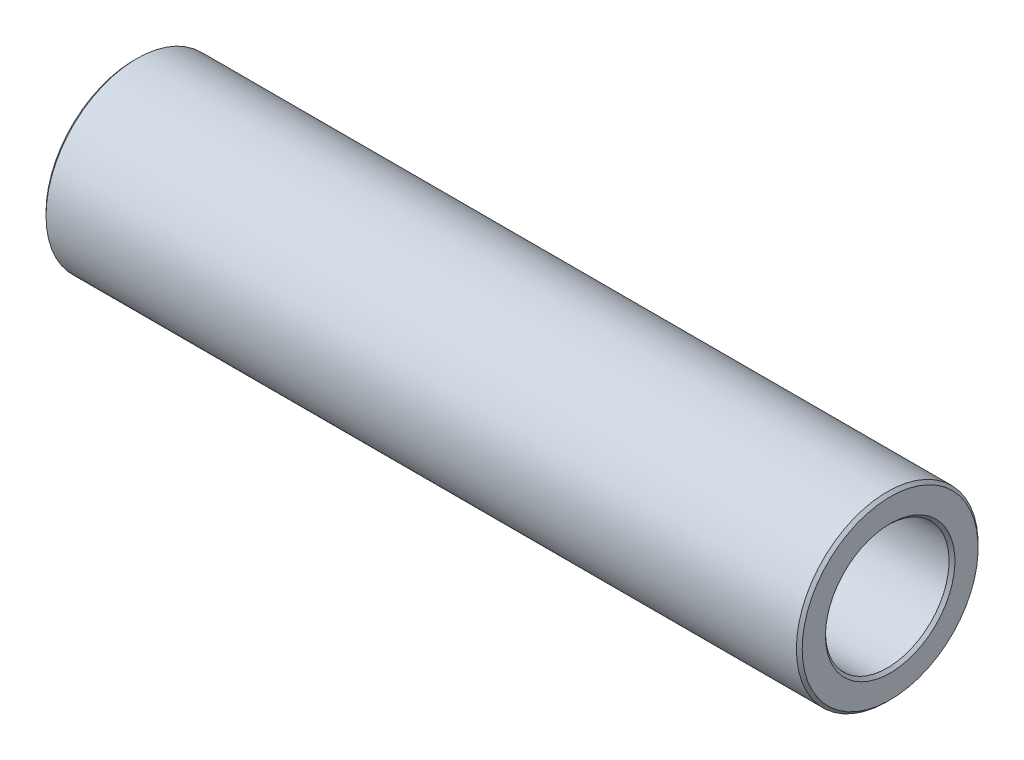
ISO-10303-21;
HEADER;
FILE_DESCRIPTION(('STEP AP214'),'2;1');
FILE_NAME('part.step','',(''),(''),'','','');
FILE_SCHEMA(('AUTOMOTIVE_DESIGN { 1 0 10303 214 1 1 1 1 }'));
ENDSEC;
DATA;
#1=APPLICATION_CONTEXT('core data for automotive mechanical design processes');
#2=APPLICATION_PROTOCOL_DEFINITION('international standard','automotive_design',2000,#1);
#3=PRODUCT_CONTEXT('',#1,'mechanical');
#4=PRODUCT('Part','Part','',(#3));
#5=PRODUCT_RELATED_PRODUCT_CATEGORY('part','',(#4));
#6=PRODUCT_DEFINITION_FORMATION('','',#4);
#7=PRODUCT_DEFINITION_CONTEXT('part definition',#1,'design');
#8=PRODUCT_DEFINITION('design','',#6,#7);
#9=PRODUCT_DEFINITION_SHAPE('','',#8);
#10=(LENGTH_UNIT() NAMED_UNIT(*) SI_UNIT(.MILLI.,.METRE.));
#11=(NAMED_UNIT(*) PLANE_ANGLE_UNIT() SI_UNIT($,.RADIAN.));
#12=(NAMED_UNIT(*) SI_UNIT($,.STERADIAN.) SOLID_ANGLE_UNIT());
#13=UNCERTAINTY_MEASURE_WITH_UNIT(LENGTH_MEASURE(1.E-05),#10,'distance_accuracy_value','');
#14=(GEOMETRIC_REPRESENTATION_CONTEXT(3) GLOBAL_UNCERTAINTY_ASSIGNED_CONTEXT((#13)) GLOBAL_UNIT_ASSIGNED_CONTEXT((#10,
#11,#12)) REPRESENTATION_CONTEXT('',''));
#15=CARTESIAN_POINT('',(0.,0.,0.));
#16=DIRECTION('',(0.,0.,1.));
#17=DIRECTION('',(1.,0.,0.));
#18=AXIS2_PLACEMENT_3D('',#15,#16,#17);
#19=CARTESIAN_POINT('',(25.,0.,0.));
#20=DIRECTION('',(-1.,0.,0.));
#21=DIRECTION('',(0.,0.,1.));
#22=AXIS2_PLACEMENT_3D('',#19,#20,#21);
#23=CYLINDRICAL_SURFACE('',#22,4.25);
#24=CARTESIAN_POINT('',(0.199999999999999,0.,0.));
#25=DIRECTION('',(-1.,0.,0.));
#26=DIRECTION('',(0.,0.,1.));
#27=AXIS2_PLACEMENT_3D('',#24,#25,#26);
#28=CIRCLE('',#27,4.25);
#29=CARTESIAN_POINT('',(0.199999999999999,0.,4.25));
#30=VERTEX_POINT('',#29);
#31=EDGE_CURVE('E54',#30,#30,#28,.T.);
#32=ORIENTED_EDGE('',*,*,#31,.T.);
#33=EDGE_LOOP('',(#32));
#34=FACE_BOUND('',#33,.T.);
#35=CARTESIAN_POINT('',(51.8,0.,0.));
#36=DIRECTION('',(-1.,0.,0.));
#37=DIRECTION('',(0.,0.,1.));
#38=AXIS2_PLACEMENT_3D('',#35,#36,#37);
#39=CIRCLE('',#38,4.25);
#40=CARTESIAN_POINT('',(51.8,0.,4.25));
#41=VERTEX_POINT('',#40);
#42=EDGE_CURVE('E57',#41,#41,#39,.T.);
#43=ORIENTED_EDGE('',*,*,#42,.F.);
#44=EDGE_LOOP('',(#43));
#45=FACE_BOUND('',#44,.T.);
#46=ADVANCED_FACE('F31',(#34,#45),#23,.F.);
#47=CARTESIAN_POINT('',(52.,6.25,0.));
#48=DIRECTION('',(-1.,0.,0.));
#49=DIRECTION('',(0.,0.,1.));
#50=AXIS2_PLACEMENT_3D('',#47,#48,#49);
#51=PLANE('',#50);
#52=CARTESIAN_POINT('',(52.,0.,0.));
#53=DIRECTION('',(-1.,0.,0.));
#54=DIRECTION('',(0.,0.,1.));
#55=AXIS2_PLACEMENT_3D('',#52,#53,#54);
#56=CIRCLE('',#55,6.05);
#57=CARTESIAN_POINT('',(52.,0.,6.05));
#58=VERTEX_POINT('',#57);
#59=EDGE_CURVE('E10',#58,#58,#56,.T.);
#60=ORIENTED_EDGE('',*,*,#59,.F.);
#61=EDGE_LOOP('',(#60));
#62=FACE_BOUND('',#61,.T.);
#63=CARTESIAN_POINT('',(52.,0.,0.));
#64=DIRECTION('',(-1.,0.,0.));
#65=DIRECTION('',(0.,0.,1.));
#66=AXIS2_PLACEMENT_3D('',#63,#64,#65);
#67=CIRCLE('',#66,4.45);
#68=CARTESIAN_POINT('',(52.,0.,4.45));
#69=VERTEX_POINT('',#68);
#70=EDGE_CURVE('E60',#69,#69,#67,.T.);
#71=ORIENTED_EDGE('',*,*,#70,.T.);
#72=EDGE_LOOP('',(#71));
#73=FACE_BOUND('',#72,.T.);
#74=ADVANCED_FACE('F64',(#62,#73),#51,.F.);
#75=CARTESIAN_POINT('',(0.,0.,0.));
#76=DIRECTION('',(1.,0.,0.));
#77=DIRECTION('',(0.,0.,-1.));
#78=AXIS2_PLACEMENT_3D('',#75,#76,#77);
#79=PLANE('',#78);
#80=CARTESIAN_POINT('',(0.,0.,0.));
#81=DIRECTION('',(-1.,0.,0.));
#82=DIRECTION('',(0.,0.,1.));
#83=AXIS2_PLACEMENT_3D('',#80,#81,#82);
#84=CIRCLE('',#83,6.05);
#85=CARTESIAN_POINT('',(0.,0.,6.05));
#86=VERTEX_POINT('',#85);
#87=EDGE_CURVE('E42',#86,#86,#84,.T.);
#88=ORIENTED_EDGE('',*,*,#87,.T.);
#89=EDGE_LOOP('',(#88));
#90=FACE_BOUND('',#89,.T.);
#91=CARTESIAN_POINT('',(0.,0.,0.));
#92=DIRECTION('',(-1.,0.,0.));
#93=DIRECTION('',(0.,0.,1.));
#94=AXIS2_PLACEMENT_3D('',#91,#92,#93);
#95=CIRCLE('',#94,4.45);
#96=CARTESIAN_POINT('',(0.,0.,4.45));
#97=VERTEX_POINT('',#96);
#98=EDGE_CURVE('E51',#97,#97,#95,.T.);
#99=ORIENTED_EDGE('',*,*,#98,.F.);
#100=EDGE_LOOP('',(#99));
#101=FACE_BOUND('',#100,.T.);
#102=ADVANCED_FACE('F33',(#90,#101),#79,.F.);
#103=CARTESIAN_POINT('',(500.,0.,0.));
#104=DIRECTION('',(-1.,0.,0.));
#105=DIRECTION('',(0.,0.,1.));
#106=AXIS2_PLACEMENT_3D('',#103,#104,#105);
#107=CYLINDRICAL_SURFACE('',#106,6.25);
#108=CARTESIAN_POINT('',(51.8,0.,0.));
#109=DIRECTION('',(-1.,0.,0.));
#110=DIRECTION('',(0.,0.,1.));
#111=AXIS2_PLACEMENT_3D('',#108,#109,#110);
#112=CIRCLE('',#111,6.25);
#113=CARTESIAN_POINT('',(51.8,0.,6.25));
#114=VERTEX_POINT('',#113);
#115=EDGE_CURVE('E38',#114,#114,#112,.T.);
#116=ORIENTED_EDGE('',*,*,#115,.T.);
#117=EDGE_LOOP('',(#116));
#118=FACE_BOUND('',#117,.T.);
#119=CARTESIAN_POINT('',(0.200000000000006,0.,0.));
#120=DIRECTION('',(-1.,0.,0.));
#121=DIRECTION('',(0.,0.,1.));
#122=AXIS2_PLACEMENT_3D('',#119,#120,#121);
#123=CIRCLE('',#122,6.25);
#124=CARTESIAN_POINT('',(0.200000000000006,0.,6.25));
#125=VERTEX_POINT('',#124);
#126=EDGE_CURVE('E46',#125,#125,#123,.T.);
#127=ORIENTED_EDGE('',*,*,#126,.F.);
#128=EDGE_LOOP('',(#127));
#129=FACE_BOUND('',#128,.T.);
#130=ADVANCED_FACE('F92',(#118,#129),#107,.T.);
#131=CARTESIAN_POINT('',(51.8,0.,0.));
#132=DIRECTION('',(-1.,0.,0.));
#133=DIRECTION('',(0.,0.,1.));
#134=AXIS2_PLACEMENT_3D('',#131,#132,#133);
#135=CONICAL_SURFACE('',#134,6.25,0.785398163397453);
#136=ORIENTED_EDGE('',*,*,#59,.T.);
#137=EDGE_LOOP('',(#136));
#138=FACE_BOUND('',#137,.T.);
#139=ORIENTED_EDGE('',*,*,#115,.F.);
#140=EDGE_LOOP('',(#139));
#141=FACE_BOUND('',#140,.T.);
#142=ADVANCED_FACE('F89',(#138,#141),#135,.T.);
#143=CARTESIAN_POINT('',(0.,0.,0.));
#144=DIRECTION('',(1.,0.,0.));
#145=DIRECTION('',(0.,0.,-1.));
#146=AXIS2_PLACEMENT_3D('',#143,#144,#145);
#147=CONICAL_SURFACE('',#146,6.05,0.785398163397435);
#148=ORIENTED_EDGE('',*,*,#126,.T.);
#149=EDGE_LOOP('',(#148));
#150=FACE_BOUND('',#149,.T.);
#151=ORIENTED_EDGE('',*,*,#87,.F.);
#152=EDGE_LOOP('',(#151));
#153=FACE_BOUND('',#152,.T.);
#154=ADVANCED_FACE('F74',(#150,#153),#147,.T.);
#155=CARTESIAN_POINT('',(0.199999999999999,0.,0.));
#156=DIRECTION('',(-1.,0.,0.));
#157=DIRECTION('',(0.,0.,1.));
#158=AXIS2_PLACEMENT_3D('',#155,#156,#157);
#159=CONICAL_SURFACE('',#158,4.25,0.78539816339745);
#160=ORIENTED_EDGE('',*,*,#98,.T.);
#161=EDGE_LOOP('',(#160));
#162=FACE_BOUND('',#161,.T.);
#163=ORIENTED_EDGE('',*,*,#31,.F.);
#164=EDGE_LOOP('',(#163));
#165=FACE_BOUND('',#164,.T.);
#166=ADVANCED_FACE('F68',(#162,#165),#159,.F.);
#167=CARTESIAN_POINT('',(52.,0.,0.));
#168=DIRECTION('',(1.,0.,0.));
#169=DIRECTION('',(0.,0.,-1.));
#170=AXIS2_PLACEMENT_3D('',#167,#168,#169);
#171=CONICAL_SURFACE('',#170,4.45,0.78539816339745);
#172=ORIENTED_EDGE('',*,*,#42,.T.);
#173=EDGE_LOOP('',(#172));
#174=FACE_BOUND('',#173,.T.);
#175=ORIENTED_EDGE('',*,*,#70,.F.);
#176=EDGE_LOOP('',(#175));
#177=FACE_BOUND('',#176,.T.);
#178=ADVANCED_FACE('F66',(#174,#177),#171,.F.);
#179=CLOSED_SHELL('',(#46,#74,#102,#130,#142,#154,#166,#178));
#180=MANIFOLD_SOLID_BREP('B2',#179);
#181=ADVANCED_BREP_SHAPE_REPRESENTATION('',(#18,#180),#14);
#182=SHAPE_DEFINITION_REPRESENTATION(#9,#181);
ENDSEC;
END-ISO-10303-21;
